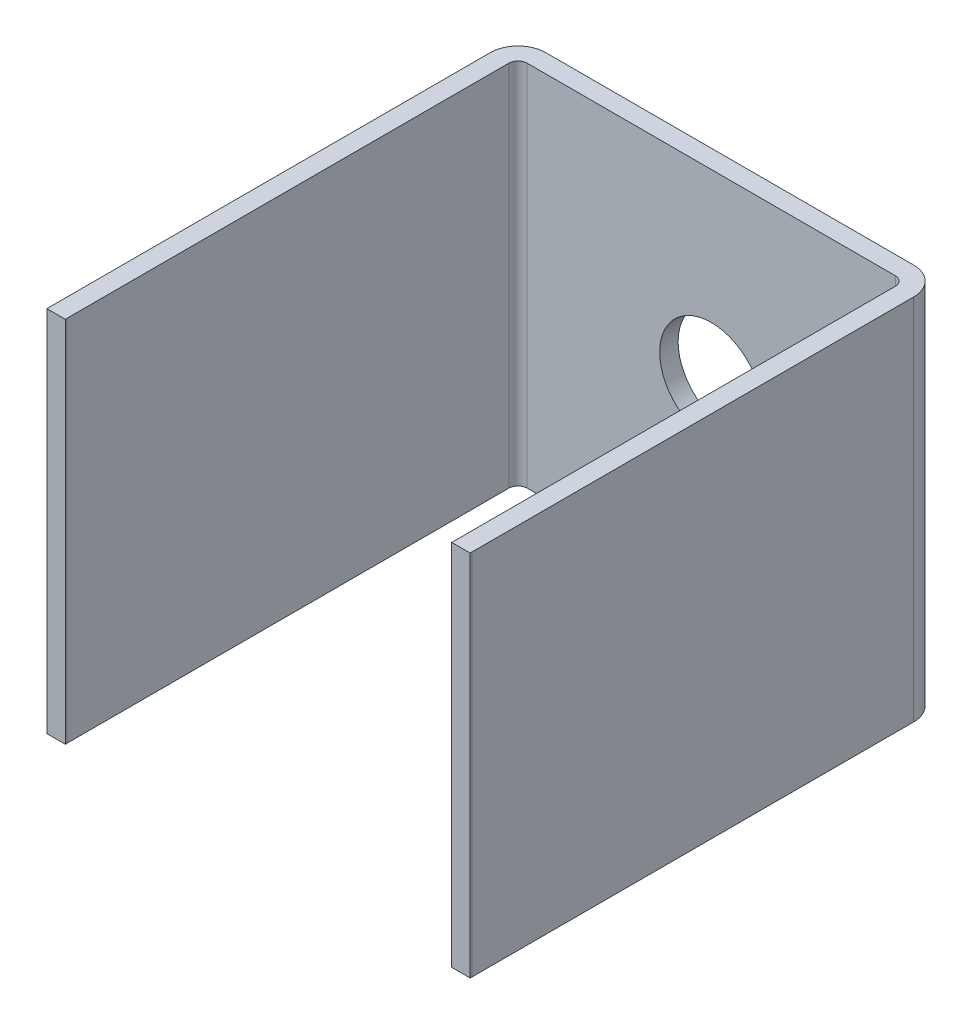
ISO-10303-21;
HEADER;
FILE_DESCRIPTION(('STEP AP214'),'2;1');
FILE_NAME('part.step','',(''),(''),'','','');
FILE_SCHEMA(('AUTOMOTIVE_DESIGN { 1 0 10303 214 1 1 1 1 }'));
ENDSEC;
DATA;
#1=APPLICATION_CONTEXT('core data for automotive mechanical design processes');
#2=APPLICATION_PROTOCOL_DEFINITION('international standard','automotive_design',2000,#1);
#3=PRODUCT_CONTEXT('',#1,'mechanical');
#4=PRODUCT('Part','Part','',(#3));
#5=PRODUCT_RELATED_PRODUCT_CATEGORY('part','',(#4));
#6=PRODUCT_DEFINITION_FORMATION('','',#4);
#7=PRODUCT_DEFINITION_CONTEXT('part definition',#1,'design');
#8=PRODUCT_DEFINITION('design','',#6,#7);
#9=PRODUCT_DEFINITION_SHAPE('','',#8);
#10=(LENGTH_UNIT() NAMED_UNIT(*) SI_UNIT(.MILLI.,.METRE.));
#11=(NAMED_UNIT(*) PLANE_ANGLE_UNIT() SI_UNIT($,.RADIAN.));
#12=(NAMED_UNIT(*) SI_UNIT($,.STERADIAN.) SOLID_ANGLE_UNIT());
#13=UNCERTAINTY_MEASURE_WITH_UNIT(LENGTH_MEASURE(1.E-05),#10,'distance_accuracy_value','');
#14=(GEOMETRIC_REPRESENTATION_CONTEXT(3) GLOBAL_UNCERTAINTY_ASSIGNED_CONTEXT((#13)) GLOBAL_UNIT_ASSIGNED_CONTEXT((#10,
#11,#12)) REPRESENTATION_CONTEXT('',''));
#15=CARTESIAN_POINT('',(0.,0.,0.));
#16=DIRECTION('',(0.,0.,1.));
#17=DIRECTION('',(1.,0.,0.));
#18=AXIS2_PLACEMENT_3D('',#15,#16,#17);
#19=CARTESIAN_POINT('',(50.,50.,-60.));
#20=DIRECTION('',(0.,-1.,0.));
#21=DIRECTION('',(0.,0.,-1.));
#22=AXIS2_PLACEMENT_3D('',#19,#20,#21);
#23=PLANE('',#22);
#24=CARTESIAN_POINT('',(-50.,50.,60.));
#25=DIRECTION('',(0.,-1.,0.));
#26=DIRECTION('',(-1.,0.,0.));
#27=AXIS2_PLACEMENT_3D('',#24,#25,#26);
#28=CIRCLE('',#27,7.50000000000011);
#29=CARTESIAN_POINT('',(-57.5,50.,60.));
#30=VERTEX_POINT('',#29);
#31=CARTESIAN_POINT('',(-57.483314773548,50.,60.5000000000001));
#32=VERTEX_POINT('',#31);
#33=EDGE_CURVE('E251',#30,#32,#28,.F.);
#34=ORIENTED_EDGE('',*,*,#33,.T.);
#35=DIRECTION('',(-1.,0.,0.));
#36=VECTOR('',#35,1.);
#37=CARTESIAN_POINT('',(58.4235052805529,50.,60.5000000000001));
#38=LINE('',#37,#36);
#39=CARTESIAN_POINT('',(-52.4494897427833,50.,60.5000000000001));
#40=VERTEX_POINT('',#39);
#41=EDGE_CURVE('E306',#40,#32,#38,.T.);
#42=ORIENTED_EDGE('',*,*,#41,.F.);
#43=CARTESIAN_POINT('',(-50.,50.,60.));
#44=DIRECTION('',(0.,-1.,0.));
#45=DIRECTION('',(-1.,0.,0.));
#46=AXIS2_PLACEMENT_3D('',#43,#44,#45);
#47=CIRCLE('',#46,2.50000000000011);
#48=CARTESIAN_POINT('',(-52.5,50.,60.));
#49=VERTEX_POINT('',#48);
#50=EDGE_CURVE('E336',#49,#40,#47,.F.);
#51=ORIENTED_EDGE('',*,*,#50,.F.);
#52=DIRECTION('',(0.,0.,1.));
#53=VECTOR('',#52,1.);
#54=CARTESIAN_POINT('',(-52.5,50.,-60.));
#55=LINE('',#54,#53);
#56=CARTESIAN_POINT('',(-52.5,50.,-60.));
#57=VERTEX_POINT('',#56);
#58=EDGE_CURVE('E334',#57,#49,#55,.T.);
#59=ORIENTED_EDGE('',*,*,#58,.F.);
#60=CARTESIAN_POINT('',(-50.,50.,-60.));
#61=DIRECTION('',(0.,-1.,0.));
#62=DIRECTION('',(-1.,0.,0.));
#63=AXIS2_PLACEMENT_3D('',#60,#61,#62);
#64=CIRCLE('',#63,2.50000000000004);
#65=CARTESIAN_POINT('',(-50.,50.,-62.5));
#66=VERTEX_POINT('',#65);
#67=EDGE_CURVE('E332',#66,#57,#64,.F.);
#68=ORIENTED_EDGE('',*,*,#67,.F.);
#69=DIRECTION('',(-1.,0.,0.));
#70=VECTOR('',#69,1.);
#71=CARTESIAN_POINT('',(50.,50.,-62.5000000000001));
#72=LINE('',#71,#70);
#73=CARTESIAN_POINT('',(50.,50.,-62.5000000000001));
#74=VERTEX_POINT('',#73);
#75=EDGE_CURVE('E330',#74,#66,#72,.T.);
#76=ORIENTED_EDGE('',*,*,#75,.F.);
#77=CARTESIAN_POINT('',(50.,50.,-60.));
#78=DIRECTION('',(0.,-1.,0.));
#79=DIRECTION('',(-1.,0.,0.));
#80=AXIS2_PLACEMENT_3D('',#77,#78,#79);
#81=CIRCLE('',#80,2.50000000000004);
#82=CARTESIAN_POINT('',(52.5,50.,-60.));
#83=VERTEX_POINT('',#82);
#84=EDGE_CURVE('E219',#83,#74,#81,.F.);
#85=ORIENTED_EDGE('',*,*,#84,.F.);
#86=DIRECTION('',(0.,0.,-1.));
#87=VECTOR('',#86,1.);
#88=CARTESIAN_POINT('',(52.5,50.,-60.));
#89=LINE('',#88,#87);
#90=CARTESIAN_POINT('',(52.5,50.,60.));
#91=VERTEX_POINT('',#90);
#92=EDGE_CURVE('E229',#91,#83,#89,.T.);
#93=ORIENTED_EDGE('',*,*,#92,.F.);
#94=CARTESIAN_POINT('',(50.,50.,60.));
#95=DIRECTION('',(0.,-1.,0.));
#96=DIRECTION('',(-1.,0.,0.));
#97=AXIS2_PLACEMENT_3D('',#94,#95,#96);
#98=CIRCLE('',#97,2.50000000000012);
#99=CARTESIAN_POINT('',(52.4494897427833,50.,60.5000000000001));
#100=VERTEX_POINT('',#99);
#101=EDGE_CURVE('E338',#100,#91,#98,.F.);
#102=ORIENTED_EDGE('',*,*,#101,.F.);
#103=CARTESIAN_POINT('',(57.483314773548,50.,60.5000000000001));
#104=VERTEX_POINT('',#103);
#105=EDGE_CURVE('E106',#104,#100,#38,.T.);
#106=ORIENTED_EDGE('',*,*,#105,.F.);
#107=CARTESIAN_POINT('',(50.,50.,60.));
#108=DIRECTION('',(0.,-1.,0.));
#109=DIRECTION('',(-1.,0.,0.));
#110=AXIS2_PLACEMENT_3D('',#107,#108,#109);
#111=CIRCLE('',#110,7.50000000000012);
#112=CARTESIAN_POINT('',(57.5000000000001,50.,60.));
#113=VERTEX_POINT('',#112);
#114=EDGE_CURVE('E254',#104,#113,#111,.F.);
#115=ORIENTED_EDGE('',*,*,#114,.T.);
#116=DIRECTION('',(0.,0.,-1.));
#117=VECTOR('',#116,1.);
#118=CARTESIAN_POINT('',(57.5,50.,-60.));
#119=LINE('',#118,#117);
#120=CARTESIAN_POINT('',(57.5,50.,-60.));
#121=VERTEX_POINT('',#120);
#122=EDGE_CURVE('E256',#113,#121,#119,.T.);
#123=ORIENTED_EDGE('',*,*,#122,.T.);
#124=CARTESIAN_POINT('',(50.,50.,-60.));
#125=DIRECTION('',(0.,-1.,0.));
#126=DIRECTION('',(-1.,0.,0.));
#127=AXIS2_PLACEMENT_3D('',#124,#125,#126);
#128=CIRCLE('',#127,7.50000000000004);
#129=CARTESIAN_POINT('',(50.,50.,-67.5000000000001));
#130=VERTEX_POINT('',#129);
#131=EDGE_CURVE('E241',#121,#130,#128,.F.);
#132=ORIENTED_EDGE('',*,*,#131,.T.);
#133=DIRECTION('',(-1.,0.,0.));
#134=VECTOR('',#133,1.);
#135=CARTESIAN_POINT('',(50.,50.,-67.5000000000001));
#136=LINE('',#135,#134);
#137=CARTESIAN_POINT('',(-50.,50.,-67.5));
#138=VERTEX_POINT('',#137);
#139=EDGE_CURVE('E244',#130,#138,#136,.T.);
#140=ORIENTED_EDGE('',*,*,#139,.T.);
#141=CARTESIAN_POINT('',(-50.,50.,-60.));
#142=DIRECTION('',(0.,-1.,0.));
#143=DIRECTION('',(-1.,0.,0.));
#144=AXIS2_PLACEMENT_3D('',#141,#142,#143);
#145=CIRCLE('',#144,7.50000000000004);
#146=CARTESIAN_POINT('',(-57.5,50.,-60.));
#147=VERTEX_POINT('',#146);
#148=EDGE_CURVE('E247',#138,#147,#145,.F.);
#149=ORIENTED_EDGE('',*,*,#148,.T.);
#150=DIRECTION('',(0.,0.,1.));
#151=VECTOR('',#150,1.);
#152=CARTESIAN_POINT('',(-57.5,50.,-60.));
#153=LINE('',#152,#151);
#154=EDGE_CURVE('E249',#147,#30,#153,.T.);
#155=ORIENTED_EDGE('',*,*,#154,.T.);
#156=EDGE_LOOP('',(#34,#42,#51,#59,#68,#76,#85,#93,#102,#106,#115,#123,#132,#140,#149,#155));
#157=FACE_BOUND('',#156,.T.);
#158=ADVANCED_FACE('F82',(#157),#23,.F.);
#159=CARTESIAN_POINT('',(50.,-50.,-60.));
#160=DIRECTION('',(0.,-1.,0.));
#161=DIRECTION('',(0.,0.,-1.));
#162=AXIS2_PLACEMENT_3D('',#159,#160,#161);
#163=PLANE('',#162);
#164=DIRECTION('',(-1.,0.,0.));
#165=VECTOR('',#164,1.);
#166=CARTESIAN_POINT('',(58.4235052805529,-50.,60.5000000000001));
#167=LINE('',#166,#165);
#168=CARTESIAN_POINT('',(-52.4494897427833,-50.,60.5000000000001));
#169=VERTEX_POINT('',#168);
#170=CARTESIAN_POINT('',(-57.483314773548,-50.,60.5000000000001));
#171=VERTEX_POINT('',#170);
#172=EDGE_CURVE('E98',#169,#171,#167,.T.);
#173=ORIENTED_EDGE('',*,*,#172,.T.);
#174=CARTESIAN_POINT('',(-50.,-50.,60.));
#175=DIRECTION('',(0.,-1.,0.));
#176=DIRECTION('',(-1.,0.,0.));
#177=AXIS2_PLACEMENT_3D('',#174,#175,#176);
#178=CIRCLE('',#177,7.50000000000011);
#179=CARTESIAN_POINT('',(-57.5,-50.,60.));
#180=VERTEX_POINT('',#179);
#181=EDGE_CURVE('E267',#180,#171,#178,.F.);
#182=ORIENTED_EDGE('',*,*,#181,.F.);
#183=DIRECTION('',(0.,0.,1.));
#184=VECTOR('',#183,1.);
#185=CARTESIAN_POINT('',(-57.5,-50.,-60.));
#186=LINE('',#185,#184);
#187=CARTESIAN_POINT('',(-57.5,-50.,-60.));
#188=VERTEX_POINT('',#187);
#189=EDGE_CURVE('E265',#188,#180,#186,.T.);
#190=ORIENTED_EDGE('',*,*,#189,.F.);
#191=CARTESIAN_POINT('',(-50.,-50.,-60.));
#192=DIRECTION('',(0.,-1.,0.));
#193=DIRECTION('',(-1.,0.,0.));
#194=AXIS2_PLACEMENT_3D('',#191,#192,#193);
#195=CIRCLE('',#194,7.50000000000004);
#196=CARTESIAN_POINT('',(-50.,-50.,-67.5));
#197=VERTEX_POINT('',#196);
#198=EDGE_CURVE('E263',#197,#188,#195,.F.);
#199=ORIENTED_EDGE('',*,*,#198,.F.);
#200=DIRECTION('',(-1.,0.,0.));
#201=VECTOR('',#200,1.);
#202=CARTESIAN_POINT('',(50.,-50.,-67.5000000000001));
#203=LINE('',#202,#201);
#204=CARTESIAN_POINT('',(50.,-50.,-67.5000000000001));
#205=VERTEX_POINT('',#204);
#206=EDGE_CURVE('E261',#205,#197,#203,.T.);
#207=ORIENTED_EDGE('',*,*,#206,.F.);
#208=CARTESIAN_POINT('',(50.,-50.,-60.));
#209=DIRECTION('',(0.,-1.,0.));
#210=DIRECTION('',(-1.,0.,0.));
#211=AXIS2_PLACEMENT_3D('',#208,#209,#210);
#212=CIRCLE('',#211,7.50000000000004);
#213=CARTESIAN_POINT('',(57.5,-50.,-60.));
#214=VERTEX_POINT('',#213);
#215=EDGE_CURVE('E240',#214,#205,#212,.F.);
#216=ORIENTED_EDGE('',*,*,#215,.F.);
#217=DIRECTION('',(0.,0.,-1.));
#218=VECTOR('',#217,1.);
#219=CARTESIAN_POINT('',(57.5,-50.,-60.));
#220=LINE('',#219,#218);
#221=CARTESIAN_POINT('',(57.5000000000001,-50.,60.));
#222=VERTEX_POINT('',#221);
#223=EDGE_CURVE('E245',#222,#214,#220,.T.);
#224=ORIENTED_EDGE('',*,*,#223,.F.);
#225=CARTESIAN_POINT('',(50.,-50.,60.));
#226=DIRECTION('',(0.,-1.,0.));
#227=DIRECTION('',(-1.,0.,0.));
#228=AXIS2_PLACEMENT_3D('',#225,#226,#227);
#229=CIRCLE('',#228,7.50000000000012);
#230=CARTESIAN_POINT('',(57.483314773548,-50.,60.5000000000001));
#231=VERTEX_POINT('',#230);
#232=EDGE_CURVE('E210',#231,#222,#229,.F.);
#233=ORIENTED_EDGE('',*,*,#232,.F.);
#234=CARTESIAN_POINT('',(52.4494897427833,-50.,60.5000000000001));
#235=VERTEX_POINT('',#234);
#236=EDGE_CURVE('E196',#231,#235,#167,.T.);
#237=ORIENTED_EDGE('',*,*,#236,.T.);
#238=CARTESIAN_POINT('',(50.,-50.,60.));
#239=DIRECTION('',(0.,-1.,0.));
#240=DIRECTION('',(-1.,0.,0.));
#241=AXIS2_PLACEMENT_3D('',#238,#239,#240);
#242=CIRCLE('',#241,2.50000000000012);
#243=CARTESIAN_POINT('',(52.5000000000001,-50.,60.));
#244=VERTEX_POINT('',#243);
#245=EDGE_CURVE('E207',#235,#244,#242,.F.);
#246=ORIENTED_EDGE('',*,*,#245,.T.);
#247=DIRECTION('',(0.,0.,-1.));
#248=VECTOR('',#247,1.);
#249=CARTESIAN_POINT('',(52.5,-50.,-60.));
#250=LINE('',#249,#248);
#251=CARTESIAN_POINT('',(52.5,-50.,-60.));
#252=VERTEX_POINT('',#251);
#253=EDGE_CURVE('E216',#244,#252,#250,.T.);
#254=ORIENTED_EDGE('',*,*,#253,.T.);
#255=CARTESIAN_POINT('',(50.,-50.,-60.));
#256=DIRECTION('',(0.,-1.,0.));
#257=DIRECTION('',(-1.,0.,0.));
#258=AXIS2_PLACEMENT_3D('',#255,#256,#257);
#259=CIRCLE('',#258,2.50000000000004);
#260=CARTESIAN_POINT('',(50.,-50.,-62.5000000000001));
#261=VERTEX_POINT('',#260);
#262=EDGE_CURVE('E341',#252,#261,#259,.F.);
#263=ORIENTED_EDGE('',*,*,#262,.T.);
#264=DIRECTION('',(-1.,0.,0.));
#265=VECTOR('',#264,1.);
#266=CARTESIAN_POINT('',(50.,-50.,-62.5000000000001));
#267=LINE('',#266,#265);
#268=CARTESIAN_POINT('',(-50.,-50.,-62.5));
#269=VERTEX_POINT('',#268);
#270=EDGE_CURVE('E344',#261,#269,#267,.T.);
#271=ORIENTED_EDGE('',*,*,#270,.T.);
#272=CARTESIAN_POINT('',(-50.,-50.,-60.));
#273=DIRECTION('',(0.,-1.,0.));
#274=DIRECTION('',(-1.,0.,0.));
#275=AXIS2_PLACEMENT_3D('',#272,#273,#274);
#276=CIRCLE('',#275,2.50000000000004);
#277=CARTESIAN_POINT('',(-52.5,-50.,-60.));
#278=VERTEX_POINT('',#277);
#279=EDGE_CURVE('E347',#269,#278,#276,.F.);
#280=ORIENTED_EDGE('',*,*,#279,.T.);
#281=DIRECTION('',(0.,0.,1.));
#282=VECTOR('',#281,1.);
#283=CARTESIAN_POINT('',(-52.5,-50.,-60.));
#284=LINE('',#283,#282);
#285=CARTESIAN_POINT('',(-52.5,-50.,60.));
#286=VERTEX_POINT('',#285);
#287=EDGE_CURVE('E222',#278,#286,#284,.T.);
#288=ORIENTED_EDGE('',*,*,#287,.T.);
#289=CARTESIAN_POINT('',(-50.,-50.,60.));
#290=DIRECTION('',(0.,-1.,0.));
#291=DIRECTION('',(-1.,0.,0.));
#292=AXIS2_PLACEMENT_3D('',#289,#290,#291);
#293=CIRCLE('',#292,2.50000000000011);
#294=EDGE_CURVE('E217',#286,#169,#293,.F.);
#295=ORIENTED_EDGE('',*,*,#294,.T.);
#296=EDGE_LOOP('',(#173,#182,#190,#199,#207,#216,#224,#233,#237,#246,#254,#263,#271,#280,#288,#295));
#297=FACE_BOUND('',#296,.T.);
#298=ADVANCED_FACE('F205',(#297),#163,.T.);
#299=CARTESIAN_POINT('',(50.,50.,-60.));
#300=DIRECTION('',(0.,-1.,0.));
#301=DIRECTION('',(0.,0.,-1.));
#302=AXIS2_PLACEMENT_3D('',#299,#300,#301);
#303=CYLINDRICAL_SURFACE('',#302,7.50000000000004);
#304=ORIENTED_EDGE('',*,*,#215,.T.);
#305=DIRECTION('',(0.,-1.,0.));
#306=VECTOR('',#305,1.);
#307=CARTESIAN_POINT('',(50.,50.,-67.5000000000001));
#308=LINE('',#307,#306);
#309=EDGE_CURVE('E12',#130,#205,#308,.T.);
#310=ORIENTED_EDGE('',*,*,#309,.F.);
#311=ORIENTED_EDGE('',*,*,#131,.F.);
#312=DIRECTION('',(0.,-1.,0.));
#313=VECTOR('',#312,1.);
#314=CARTESIAN_POINT('',(57.5,50.,-60.));
#315=LINE('',#314,#313);
#316=EDGE_CURVE('E258',#121,#214,#315,.T.);
#317=ORIENTED_EDGE('',*,*,#316,.T.);
#318=EDGE_LOOP('',(#304,#310,#311,#317));
#319=FACE_BOUND('',#318,.T.);
#320=ADVANCED_FACE('F84',(#319),#303,.T.);
#321=CARTESIAN_POINT('',(50.,50.,-67.5000000000001));
#322=DIRECTION('',(0.,0.,1.));
#323=DIRECTION('',(1.,0.,0.));
#324=AXIS2_PLACEMENT_3D('',#321,#322,#323);
#325=PLANE('',#324);
#326=CARTESIAN_POINT('',(0.,0.,-67.5000000000001));
#327=DIRECTION('',(0.,0.,-1.));
#328=DIRECTION('',(-1.,0.,0.));
#329=AXIS2_PLACEMENT_3D('',#326,#327,#328);
#330=CIRCLE('',#329,14.);
#331=CARTESIAN_POINT('',(-14.,0.,-67.5000000000001));
#332=VERTEX_POINT('',#331);
#333=EDGE_CURVE('E326',#332,#332,#330,.T.);
#334=ORIENTED_EDGE('',*,*,#333,.F.);
#335=EDGE_LOOP('',(#334));
#336=FACE_BOUND('',#335,.T.);
#337=ORIENTED_EDGE('',*,*,#206,.T.);
#338=DIRECTION('',(0.,-1.,0.));
#339=VECTOR('',#338,1.);
#340=CARTESIAN_POINT('',(-50.,50.,-67.5));
#341=LINE('',#340,#339);
#342=EDGE_CURVE('E91',#138,#197,#341,.T.);
#343=ORIENTED_EDGE('',*,*,#342,.F.);
#344=ORIENTED_EDGE('',*,*,#139,.F.);
#345=ORIENTED_EDGE('',*,*,#309,.T.);
#346=EDGE_LOOP('',(#337,#343,#344,#345));
#347=FACE_BOUND('',#346,.T.);
#348=ADVANCED_FACE('F310',(#336,#347),#325,.F.);
#349=CARTESIAN_POINT('',(-50.,50.,-60.));
#350=DIRECTION('',(0.,-1.,0.));
#351=DIRECTION('',(0.,0.,-1.));
#352=AXIS2_PLACEMENT_3D('',#349,#350,#351);
#353=CYLINDRICAL_SURFACE('',#352,7.50000000000004);
#354=ORIENTED_EDGE('',*,*,#198,.T.);
#355=DIRECTION('',(0.,-1.,0.));
#356=VECTOR('',#355,1.);
#357=CARTESIAN_POINT('',(-57.5,50.,-60.));
#358=LINE('',#357,#356);
#359=EDGE_CURVE('E280',#147,#188,#358,.T.);
#360=ORIENTED_EDGE('',*,*,#359,.F.);
#361=ORIENTED_EDGE('',*,*,#148,.F.);
#362=ORIENTED_EDGE('',*,*,#342,.T.);
#363=EDGE_LOOP('',(#354,#360,#361,#362));
#364=FACE_BOUND('',#363,.T.);
#365=ADVANCED_FACE('F288',(#364),#353,.T.);
#366=CARTESIAN_POINT('',(-57.5,50.,-60.));
#367=DIRECTION('',(1.,0.,0.));
#368=DIRECTION('',(0.,0.,-1.));
#369=AXIS2_PLACEMENT_3D('',#366,#367,#368);
#370=PLANE('',#369);
#371=ORIENTED_EDGE('',*,*,#189,.T.);
#372=DIRECTION('',(0.,-1.,0.));
#373=VECTOR('',#372,1.);
#374=CARTESIAN_POINT('',(-57.5,50.,60.));
#375=LINE('',#374,#373);
#376=EDGE_CURVE('E277',#30,#180,#375,.T.);
#377=ORIENTED_EDGE('',*,*,#376,.F.);
#378=ORIENTED_EDGE('',*,*,#154,.F.);
#379=ORIENTED_EDGE('',*,*,#359,.T.);
#380=EDGE_LOOP('',(#371,#377,#378,#379));
#381=FACE_BOUND('',#380,.T.);
#382=ADVANCED_FACE('F296',(#381),#370,.F.);
#383=CARTESIAN_POINT('',(-50.,50.,60.));
#384=DIRECTION('',(0.,-1.,0.));
#385=DIRECTION('',(0.,0.,-1.));
#386=AXIS2_PLACEMENT_3D('',#383,#384,#385);
#387=CYLINDRICAL_SURFACE('',#386,7.50000000000011);
#388=ORIENTED_EDGE('',*,*,#181,.T.);
#389=DIRECTION('',(0.,-1.,0.));
#390=VECTOR('',#389,1.);
#391=CARTESIAN_POINT('',(-57.483314773548,50.,60.5000000000001));
#392=LINE('',#391,#390);
#393=EDGE_CURVE('E302',#32,#171,#392,.T.);
#394=ORIENTED_EDGE('',*,*,#393,.F.);
#395=ORIENTED_EDGE('',*,*,#33,.F.);
#396=ORIENTED_EDGE('',*,*,#376,.T.);
#397=EDGE_LOOP('',(#388,#394,#395,#396));
#398=FACE_BOUND('',#397,.T.);
#399=ADVANCED_FACE('F300',(#398),#387,.T.);
#400=CARTESIAN_POINT('',(50.,50.,60.));
#401=DIRECTION('',(0.,-1.,0.));
#402=DIRECTION('',(0.,0.,-1.));
#403=AXIS2_PLACEMENT_3D('',#400,#401,#402);
#404=CYLINDRICAL_SURFACE('',#403,7.50000000000012);
#405=ORIENTED_EDGE('',*,*,#114,.F.);
#406=DIRECTION('',(0.,-1.,0.));
#407=VECTOR('',#406,1.);
#408=CARTESIAN_POINT('',(57.483314773548,50.,60.5000000000001));
#409=LINE('',#408,#407);
#410=EDGE_CURVE('E320',#231,#104,#409,.F.);
#411=ORIENTED_EDGE('',*,*,#410,.F.);
#412=ORIENTED_EDGE('',*,*,#232,.T.);
#413=DIRECTION('',(0.,-1.,0.));
#414=VECTOR('',#413,1.);
#415=CARTESIAN_POINT('',(57.5000000000001,50.,60.));
#416=LINE('',#415,#414);
#417=EDGE_CURVE('E274',#113,#222,#416,.T.);
#418=ORIENTED_EDGE('',*,*,#417,.F.);
#419=EDGE_LOOP('',(#405,#411,#412,#418));
#420=FACE_BOUND('',#419,.T.);
#421=ADVANCED_FACE('F319',(#420),#404,.T.);
#422=CARTESIAN_POINT('',(57.5,50.,-60.));
#423=DIRECTION('',(-1.,0.,0.));
#424=DIRECTION('',(0.,0.,1.));
#425=AXIS2_PLACEMENT_3D('',#422,#423,#424);
#426=PLANE('',#425);
#427=ORIENTED_EDGE('',*,*,#223,.T.);
#428=ORIENTED_EDGE('',*,*,#316,.F.);
#429=ORIENTED_EDGE('',*,*,#122,.F.);
#430=ORIENTED_EDGE('',*,*,#417,.T.);
#431=EDGE_LOOP('',(#427,#428,#429,#430));
#432=FACE_BOUND('',#431,.T.);
#433=ADVANCED_FACE('F314',(#432),#426,.F.);
#434=CARTESIAN_POINT('',(50.,50.,-60.));
#435=DIRECTION('',(0.,-1.,0.));
#436=DIRECTION('',(0.,0.,-1.));
#437=AXIS2_PLACEMENT_3D('',#434,#435,#436);
#438=CYLINDRICAL_SURFACE('',#437,2.50000000000004);
#439=ORIENTED_EDGE('',*,*,#262,.F.);
#440=DIRECTION('',(0.,-1.,0.));
#441=VECTOR('',#440,1.);
#442=CARTESIAN_POINT('',(52.5,50.,-60.));
#443=LINE('',#442,#441);
#444=EDGE_CURVE('E226',#83,#252,#443,.T.);
#445=ORIENTED_EDGE('',*,*,#444,.F.);
#446=ORIENTED_EDGE('',*,*,#84,.T.);
#447=DIRECTION('',(0.,-1.,0.));
#448=VECTOR('',#447,1.);
#449=CARTESIAN_POINT('',(50.,50.,-62.5000000000001));
#450=LINE('',#449,#448);
#451=EDGE_CURVE('E237',#74,#261,#450,.T.);
#452=ORIENTED_EDGE('',*,*,#451,.T.);
#453=EDGE_LOOP('',(#439,#445,#446,#452));
#454=FACE_BOUND('',#453,.T.);
#455=ADVANCED_FACE('F375',(#454),#438,.F.);
#456=CARTESIAN_POINT('',(50.,50.,-62.5000000000001));
#457=DIRECTION('',(0.,0.,1.));
#458=DIRECTION('',(1.,0.,0.));
#459=AXIS2_PLACEMENT_3D('',#456,#457,#458);
#460=PLANE('',#459);
#461=CARTESIAN_POINT('',(0.,0.,-62.5000000000001));
#462=DIRECTION('',(0.,0.,1.));
#463=DIRECTION('',(1.,0.,0.));
#464=AXIS2_PLACEMENT_3D('',#461,#462,#463);
#465=CIRCLE('',#464,14.);
#466=CARTESIAN_POINT('',(14.,0.,-62.5000000000001));
#467=VERTEX_POINT('',#466);
#468=EDGE_CURVE('E86',#467,#467,#465,.T.);
#469=ORIENTED_EDGE('',*,*,#468,.F.);
#470=EDGE_LOOP('',(#469));
#471=FACE_BOUND('',#470,.T.);
#472=ORIENTED_EDGE('',*,*,#270,.F.);
#473=ORIENTED_EDGE('',*,*,#451,.F.);
#474=ORIENTED_EDGE('',*,*,#75,.T.);
#475=DIRECTION('',(0.,-1.,0.));
#476=VECTOR('',#475,1.);
#477=CARTESIAN_POINT('',(-50.,50.,-62.5));
#478=LINE('',#477,#476);
#479=EDGE_CURVE('E235',#66,#269,#478,.T.);
#480=ORIENTED_EDGE('',*,*,#479,.T.);
#481=EDGE_LOOP('',(#472,#473,#474,#480));
#482=FACE_BOUND('',#481,.T.);
#483=ADVANCED_FACE('F412',(#471,#482),#460,.T.);
#484=CARTESIAN_POINT('',(-50.,50.,-60.));
#485=DIRECTION('',(0.,-1.,0.));
#486=DIRECTION('',(0.,0.,-1.));
#487=AXIS2_PLACEMENT_3D('',#484,#485,#486);
#488=CYLINDRICAL_SURFACE('',#487,2.50000000000004);
#489=ORIENTED_EDGE('',*,*,#279,.F.);
#490=ORIENTED_EDGE('',*,*,#479,.F.);
#491=ORIENTED_EDGE('',*,*,#67,.T.);
#492=DIRECTION('',(0.,-1.,0.));
#493=VECTOR('',#492,1.);
#494=CARTESIAN_POINT('',(-52.5,50.,-60.));
#495=LINE('',#494,#493);
#496=EDGE_CURVE('E233',#57,#278,#495,.T.);
#497=ORIENTED_EDGE('',*,*,#496,.T.);
#498=EDGE_LOOP('',(#489,#490,#491,#497));
#499=FACE_BOUND('',#498,.T.);
#500=ADVANCED_FACE('F410',(#499),#488,.F.);
#501=CARTESIAN_POINT('',(-52.5,50.,-60.));
#502=DIRECTION('',(1.,0.,0.));
#503=DIRECTION('',(0.,0.,-1.));
#504=AXIS2_PLACEMENT_3D('',#501,#502,#503);
#505=PLANE('',#504);
#506=ORIENTED_EDGE('',*,*,#287,.F.);
#507=ORIENTED_EDGE('',*,*,#496,.F.);
#508=ORIENTED_EDGE('',*,*,#58,.T.);
#509=DIRECTION('',(0.,-1.,0.));
#510=VECTOR('',#509,1.);
#511=CARTESIAN_POINT('',(-52.5,50.,60.));
#512=LINE('',#511,#510);
#513=EDGE_CURVE('E231',#49,#286,#512,.T.);
#514=ORIENTED_EDGE('',*,*,#513,.T.);
#515=EDGE_LOOP('',(#506,#507,#508,#514));
#516=FACE_BOUND('',#515,.T.);
#517=ADVANCED_FACE('F355',(#516),#505,.T.);
#518=CARTESIAN_POINT('',(-50.,50.,60.));
#519=DIRECTION('',(0.,-1.,0.));
#520=DIRECTION('',(0.,0.,-1.));
#521=AXIS2_PLACEMENT_3D('',#518,#519,#520);
#522=CYLINDRICAL_SURFACE('',#521,2.50000000000011);
#523=DIRECTION('',(0.,-1.,0.));
#524=VECTOR('',#523,1.);
#525=CARTESIAN_POINT('',(-52.4494897427833,50.,60.5000000000001));
#526=LINE('',#525,#524);
#527=EDGE_CURVE('E201',#40,#169,#526,.T.);
#528=ORIENTED_EDGE('',*,*,#527,.T.);
#529=ORIENTED_EDGE('',*,*,#294,.F.);
#530=ORIENTED_EDGE('',*,*,#513,.F.);
#531=ORIENTED_EDGE('',*,*,#50,.T.);
#532=EDGE_LOOP('',(#528,#529,#530,#531));
#533=FACE_BOUND('',#532,.T.);
#534=ADVANCED_FACE('F359',(#533),#522,.F.);
#535=CARTESIAN_POINT('',(50.,50.,60.));
#536=DIRECTION('',(0.,-1.,0.));
#537=DIRECTION('',(0.,0.,-1.));
#538=AXIS2_PLACEMENT_3D('',#535,#536,#537);
#539=CYLINDRICAL_SURFACE('',#538,2.50000000000012);
#540=DIRECTION('',(0.,-1.,0.));
#541=VECTOR('',#540,1.);
#542=CARTESIAN_POINT('',(52.4494897427833,50.,60.5000000000001));
#543=LINE('',#542,#541);
#544=EDGE_CURVE('E193',#235,#100,#543,.F.);
#545=ORIENTED_EDGE('',*,*,#544,.T.);
#546=ORIENTED_EDGE('',*,*,#101,.T.);
#547=DIRECTION('',(0.,-1.,0.));
#548=VECTOR('',#547,1.);
#549=CARTESIAN_POINT('',(52.5000000000001,50.,60.));
#550=LINE('',#549,#548);
#551=EDGE_CURVE('E214',#91,#244,#550,.T.);
#552=ORIENTED_EDGE('',*,*,#551,.T.);
#553=ORIENTED_EDGE('',*,*,#245,.F.);
#554=EDGE_LOOP('',(#545,#546,#552,#553));
#555=FACE_BOUND('',#554,.T.);
#556=ADVANCED_FACE('F212',(#555),#539,.F.);
#557=CARTESIAN_POINT('',(52.5,50.,-60.));
#558=DIRECTION('',(-1.,0.,0.));
#559=DIRECTION('',(0.,0.,1.));
#560=AXIS2_PLACEMENT_3D('',#557,#558,#559);
#561=PLANE('',#560);
#562=ORIENTED_EDGE('',*,*,#253,.F.);
#563=ORIENTED_EDGE('',*,*,#551,.F.);
#564=ORIENTED_EDGE('',*,*,#92,.T.);
#565=ORIENTED_EDGE('',*,*,#444,.T.);
#566=EDGE_LOOP('',(#562,#563,#564,#565));
#567=FACE_BOUND('',#566,.T.);
#568=ADVANCED_FACE('F395',(#567),#561,.T.);
#569=CARTESIAN_POINT('',(0.,0.,-57.5000000000001));
#570=DIRECTION('',(0.,0.,-1.));
#571=DIRECTION('',(-1.,0.,0.));
#572=AXIS2_PLACEMENT_3D('',#569,#570,#571);
#573=CYLINDRICAL_SURFACE('',#572,14.);
#574=ORIENTED_EDGE('',*,*,#468,.T.);
#575=EDGE_LOOP('',(#574));
#576=FACE_BOUND('',#575,.T.);
#577=ORIENTED_EDGE('',*,*,#333,.T.);
#578=EDGE_LOOP('',(#577));
#579=FACE_BOUND('',#578,.T.);
#580=ADVANCED_FACE('F366',(#576,#579),#573,.F.);
#581=CARTESIAN_POINT('',(58.4235052805529,-50.001,60.5000000000001));
#582=DIRECTION('',(0.,0.,-1.));
#583=DIRECTION('',(-1.,0.,0.));
#584=AXIS2_PLACEMENT_3D('',#581,#582,#583);
#585=PLANE('',#584);
#586=ORIENTED_EDGE('',*,*,#410,.T.);
#587=ORIENTED_EDGE('',*,*,#105,.T.);
#588=ORIENTED_EDGE('',*,*,#544,.F.);
#589=ORIENTED_EDGE('',*,*,#236,.F.);
#590=EDGE_LOOP('',(#586,#587,#588,#589));
#591=FACE_BOUND('',#590,.T.);
#592=ADVANCED_FACE('F195',(#591),#585,.F.);
#593=ORIENTED_EDGE('',*,*,#393,.T.);
#594=ORIENTED_EDGE('',*,*,#172,.F.);
#595=ORIENTED_EDGE('',*,*,#527,.F.);
#596=ORIENTED_EDGE('',*,*,#41,.T.);
#597=EDGE_LOOP('',(#593,#594,#595,#596));
#598=FACE_BOUND('',#597,.T.);
#599=ADVANCED_FACE('F360',(#598),#585,.F.);
#600=CLOSED_SHELL('',(#158,#298,#320,#348,#365,#382,#399,#421,#433,#455,#483,#500,#517,#534,
#556,#568,#580,#592,#599));
#601=MANIFOLD_SOLID_BREP('B2',#600);
#602=ADVANCED_BREP_SHAPE_REPRESENTATION('',(#18,#601),#14);
#603=SHAPE_DEFINITION_REPRESENTATION(#9,#602);
ENDSEC;
END-ISO-10303-21;
